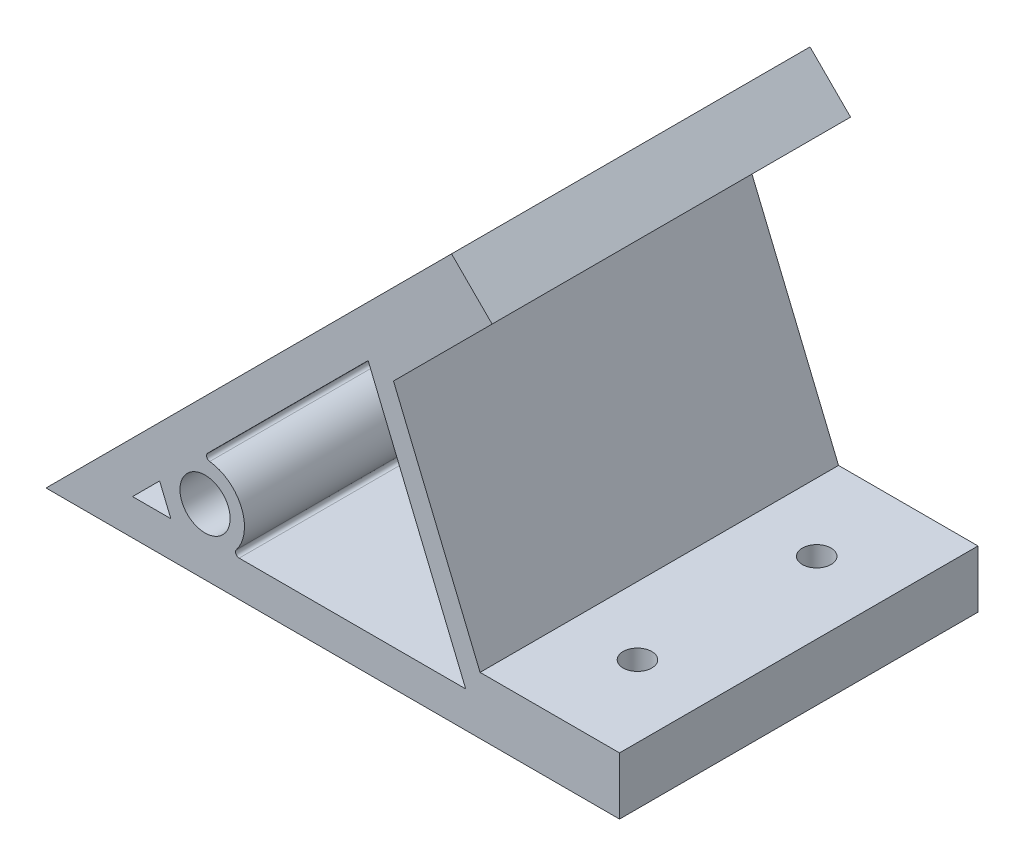
ISO-10303-21;
HEADER;
FILE_DESCRIPTION(('STEP AP214'),'2;1');
FILE_NAME('part.step','',(''),(''),'','','');
FILE_SCHEMA(('AUTOMOTIVE_DESIGN { 1 0 10303 214 1 1 1 1 }'));
ENDSEC;
DATA;
#1=APPLICATION_CONTEXT('core data for automotive mechanical design processes');
#2=APPLICATION_PROTOCOL_DEFINITION('international standard','automotive_design',2000,#1);
#3=PRODUCT_CONTEXT('',#1,'mechanical');
#4=PRODUCT('Part','Part','',(#3));
#5=PRODUCT_RELATED_PRODUCT_CATEGORY('part','',(#4));
#6=PRODUCT_DEFINITION_FORMATION('','',#4);
#7=PRODUCT_DEFINITION_CONTEXT('part definition',#1,'design');
#8=PRODUCT_DEFINITION('design','',#6,#7);
#9=PRODUCT_DEFINITION_SHAPE('','',#8);
#10=(LENGTH_UNIT() NAMED_UNIT(*) SI_UNIT(.MILLI.,.METRE.));
#11=(NAMED_UNIT(*) PLANE_ANGLE_UNIT() SI_UNIT($,.RADIAN.));
#12=(NAMED_UNIT(*) SI_UNIT($,.STERADIAN.) SOLID_ANGLE_UNIT());
#13=UNCERTAINTY_MEASURE_WITH_UNIT(LENGTH_MEASURE(1.E-05),#10,'distance_accuracy_value','');
#14=(GEOMETRIC_REPRESENTATION_CONTEXT(3) GLOBAL_UNCERTAINTY_ASSIGNED_CONTEXT((#13)) GLOBAL_UNIT_ASSIGNED_CONTEXT((#10,
#11,#12)) REPRESENTATION_CONTEXT('',''));
#15=CARTESIAN_POINT('',(0.,0.,0.));
#16=DIRECTION('',(0.,0.,1.));
#17=DIRECTION('',(1.,0.,0.));
#18=AXIS2_PLACEMENT_3D('',#15,#16,#17);
#19=CARTESIAN_POINT('',(80.,0.,25.));
#20=DIRECTION('',(0.,0.,1.));
#21=DIRECTION('',(1.,0.,0.));
#22=AXIS2_PLACEMENT_3D('',#19,#20,#21);
#23=PLANE('',#22);
#24=CARTESIAN_POINT('',(22.1846771867485,9.15647377294881,25.));
#25=DIRECTION('',(0.,0.,1.));
#26=DIRECTION('',(1.,0.,0.));
#27=AXIS2_PLACEMENT_3D('',#24,#25,#26);
#28=CIRCLE('',#27,3.5);
#29=CARTESIAN_POINT('',(25.6846771867485,9.15647377294881,25.));
#30=VERTEX_POINT('',#29);
#31=EDGE_CURVE('E211',#30,#30,#28,.T.);
#32=ORIENTED_EDGE('',*,*,#31,.F.);
#33=EDGE_LOOP('',(#32));
#34=FACE_BOUND('',#33,.T.);
#35=DIRECTION('',(1.,0.,0.));
#36=VECTOR('',#35,1.);
#37=CARTESIAN_POINT('',(0.,0.,25.));
#38=LINE('',#37,#36);
#39=CARTESIAN_POINT('',(0.,0.,25.));
#40=VERTEX_POINT('',#39);
#41=CARTESIAN_POINT('',(80.,0.,25.));
#42=VERTEX_POINT('',#41);
#43=EDGE_CURVE('E241',#40,#42,#38,.T.);
#44=ORIENTED_EDGE('',*,*,#43,.T.);
#45=DIRECTION('',(0.,1.,0.));
#46=VECTOR('',#45,1.);
#47=CARTESIAN_POINT('',(80.,0.,25.));
#48=LINE('',#47,#46);
#49=CARTESIAN_POINT('',(80.,8.,25.));
#50=VERTEX_POINT('',#49);
#51=EDGE_CURVE('E244',#42,#50,#48,.T.);
#52=ORIENTED_EDGE('',*,*,#51,.T.);
#53=DIRECTION('',(-1.,0.,0.));
#54=VECTOR('',#53,1.);
#55=CARTESIAN_POINT('',(60.5474313182664,8.,25.));
#56=LINE('',#55,#54);
#57=CARTESIAN_POINT('',(60.5474313182664,8.,25.));
#58=VERTEX_POINT('',#57);
#59=EDGE_CURVE('E247',#50,#58,#56,.T.);
#60=ORIENTED_EDGE('',*,*,#59,.T.);
#61=DIRECTION('',(-0.382683432365087,0.923879532511288,0.));
#62=VECTOR('',#61,1.);
#63=CARTESIAN_POINT('',(60.5474313182664,8.,25.));
#64=LINE('',#63,#62);
#65=CARTESIAN_POINT('',(48.4703535180654,37.1566450190806,25.));
#66=VERTEX_POINT('',#65);
#67=EDGE_CURVE('E249',#58,#66,#64,.T.);
#68=ORIENTED_EDGE('',*,*,#67,.T.);
#69=DIRECTION('',(0.707106781186547,0.707106781186548,0.));
#70=VECTOR('',#69,1.);
#71=CARTESIAN_POINT('',(48.4703535180654,37.1566450190806,25.));
#72=LINE('',#71,#70);
#73=CARTESIAN_POINT('',(62.2253967444162,50.9116882454314,25.));
#74=VERTEX_POINT('',#73);
#75=EDGE_CURVE('E251',#66,#74,#72,.T.);
#76=ORIENTED_EDGE('',*,*,#75,.T.);
#77=DIRECTION('',(-0.707106781186549,0.707106781186546,0.));
#78=VECTOR('',#77,1.);
#79=CARTESIAN_POINT('',(62.2253967444162,50.9116882454314,25.));
#80=LINE('',#79,#78);
#81=CARTESIAN_POINT('',(56.5685424949237,56.5685424949239,25.));
#82=VERTEX_POINT('',#81);
#83=EDGE_CURVE('E253',#74,#82,#80,.T.);
#84=ORIENTED_EDGE('',*,*,#83,.T.);
#85=DIRECTION('',(-0.707106781186546,-0.707106781186549,0.));
#86=VECTOR('',#85,1.);
#87=CARTESIAN_POINT('',(0.,0.,25.));
#88=LINE('',#87,#86);
#89=EDGE_CURVE('E255',#82,#40,#88,.T.);
#90=ORIENTED_EDGE('',*,*,#89,.T.);
#91=EDGE_LOOP('',(#44,#52,#60,#68,#76,#84,#90));
#92=FACE_BOUND('',#91,.T.);
#93=DIRECTION('',(-0.382683432365087,0.923879532511288,0.));
#94=VECTOR('',#93,1.);
#95=CARTESIAN_POINT('',(15.8476713770087,8.77660356514327,25.));
#96=LINE('',#95,#94);
#97=CARTESIAN_POINT('',(17.4119917933976,5.,25.));
#98=VERTEX_POINT('',#97);
#99=CARTESIAN_POINT('',(15.8476713770087,8.77660356514326,25.));
#100=VERTEX_POINT('',#99);
#101=EDGE_CURVE('E219',#98,#100,#96,.T.);
#102=ORIENTED_EDGE('',*,*,#101,.F.);
#103=DIRECTION('',(1.,0.,0.));
#104=VECTOR('',#103,1.);
#105=CARTESIAN_POINT('',(12.0710678118655,5.,25.));
#106=LINE('',#105,#104);
#107=CARTESIAN_POINT('',(12.0710678118655,5.,25.));
#108=VERTEX_POINT('',#107);
#109=EDGE_CURVE('E217',#108,#98,#106,.T.);
#110=ORIENTED_EDGE('',*,*,#109,.F.);
#111=DIRECTION('',(-0.707106781186543,-0.707106781186552,0.));
#112=VECTOR('',#111,1.);
#113=CARTESIAN_POINT('',(12.0710678118655,5.,25.));
#114=LINE('',#113,#112);
#115=EDGE_CURVE('E223',#100,#108,#114,.T.);
#116=ORIENTED_EDGE('',*,*,#115,.F.);
#117=EDGE_LOOP('',(#102,#110,#116));
#118=FACE_BOUND('',#117,.T.);
#119=DIRECTION('',(1.,0.,0.));
#120=VECTOR('',#119,1.);
#121=CARTESIAN_POINT('',(26.9417981172838,5.,25.));
#122=LINE('',#121,#120);
#123=CARTESIAN_POINT('',(26.9417981172838,5.,25.));
#124=VERTEX_POINT('',#123);
#125=CARTESIAN_POINT('',(58.5428954045085,5.,25.));
#126=VERTEX_POINT('',#125);
#127=EDGE_CURVE('E166',#124,#126,#122,.T.);
#128=ORIENTED_EDGE('',*,*,#127,.F.);
#129=CARTESIAN_POINT('',(26.9417981172838,5.5,25.));
#130=DIRECTION('',(0.,0.,1.));
#131=DIRECTION('',(-1.,0.,0.));
#132=AXIS2_PLACEMENT_3D('',#129,#130,#131);
#133=CIRCLE('',#132,0.5);
#134=CARTESIAN_POINT('',(26.5453713730726,5.80470614774571,25.));
#135=VERTEX_POINT('',#134);
#136=EDGE_CURVE('E158',#135,#124,#133,.T.);
#137=ORIENTED_EDGE('',*,*,#136,.F.);
#138=CARTESIAN_POINT('',(22.1846771867485,9.15647377294881,25.));
#139=DIRECTION('',(0.,0.,-1.));
#140=DIRECTION('',(1.,0.,0.));
#141=AXIS2_PLACEMENT_3D('',#138,#139,#140);
#142=CIRCLE('',#141,5.5);
#143=CARTESIAN_POINT('',(22.8337204048437,14.6180434100627,25.));
#144=VERTEX_POINT('',#143);
#145=EDGE_CURVE('E188',#144,#135,#142,.T.);
#146=ORIENTED_EDGE('',*,*,#145,.F.);
#147=CARTESIAN_POINT('',(22.8927243337614,15.1145497407095,25.));
#148=DIRECTION('',(0.,0.,1.));
#149=DIRECTION('',(1.,0.,0.));
#150=AXIS2_PLACEMENT_3D('',#147,#148,#149);
#151=CIRCLE('',#150,0.500000000000001);
#152=CARTESIAN_POINT('',(22.5391709431682,15.4681031313028,25.));
#153=VERTEX_POINT('',#152);
#154=EDGE_CURVE('E186',#153,#144,#151,.T.);
#155=ORIENTED_EDGE('',*,*,#154,.F.);
#156=DIRECTION('',(-0.707106781186546,-0.707106781186549,0.));
#157=VECTOR('',#156,1.);
#158=CARTESIAN_POINT('',(22.5391709431682,15.4681031313028,25.));
#159=LINE('',#158,#157);
#160=CARTESIAN_POINT('',(44.9316122367555,37.8605444248902,25.));
#161=VERTEX_POINT('',#160);
#162=EDGE_CURVE('E181',#161,#153,#159,.T.);
#163=ORIENTED_EDGE('',*,*,#162,.F.);
#164=DIRECTION('',(-0.382683432365087,0.923879532511288,0.));
#165=VECTOR('',#164,1.);
#166=CARTESIAN_POINT('',(58.5428954045085,5.,25.));
#167=LINE('',#166,#165);
#168=EDGE_CURVE('E179',#126,#161,#167,.T.);
#169=ORIENTED_EDGE('',*,*,#168,.F.);
#170=EDGE_LOOP('',(#128,#137,#146,#155,#163,#169));
#171=FACE_BOUND('',#170,.T.);
#172=ADVANCED_FACE('F43',(#34,#92,#118,#171),#23,.T.);
#173=CARTESIAN_POINT('',(80.,0.,-25.));
#174=DIRECTION('',(0.,0.,1.));
#175=DIRECTION('',(1.,0.,0.));
#176=AXIS2_PLACEMENT_3D('',#173,#174,#175);
#177=PLANE('',#176);
#178=CARTESIAN_POINT('',(22.1846771867485,9.15647377294881,-25.));
#179=DIRECTION('',(0.,0.,1.));
#180=DIRECTION('',(1.,0.,0.));
#181=AXIS2_PLACEMENT_3D('',#178,#179,#180);
#182=CIRCLE('',#181,3.5);
#183=CARTESIAN_POINT('',(25.6846771867485,9.15647377294881,-25.));
#184=VERTEX_POINT('',#183);
#185=EDGE_CURVE('E174',#184,#184,#182,.T.);
#186=ORIENTED_EDGE('',*,*,#185,.T.);
#187=EDGE_LOOP('',(#186));
#188=FACE_BOUND('',#187,.T.);
#189=DIRECTION('',(1.,0.,0.));
#190=VECTOR('',#189,1.);
#191=CARTESIAN_POINT('',(0.,0.,-25.));
#192=LINE('',#191,#190);
#193=CARTESIAN_POINT('',(0.,0.,-25.));
#194=VERTEX_POINT('',#193);
#195=CARTESIAN_POINT('',(80.,0.,-25.));
#196=VERTEX_POINT('',#195);
#197=EDGE_CURVE('E240',#194,#196,#192,.T.);
#198=ORIENTED_EDGE('',*,*,#197,.F.);
#199=DIRECTION('',(-0.707106781186546,-0.707106781186549,0.));
#200=VECTOR('',#199,1.);
#201=CARTESIAN_POINT('',(0.,0.,-25.));
#202=LINE('',#201,#200);
#203=CARTESIAN_POINT('',(56.5685424949237,56.5685424949239,-25.));
#204=VERTEX_POINT('',#203);
#205=EDGE_CURVE('E245',#204,#194,#202,.T.);
#206=ORIENTED_EDGE('',*,*,#205,.F.);
#207=DIRECTION('',(-0.707106781186549,0.707106781186546,0.));
#208=VECTOR('',#207,1.);
#209=CARTESIAN_POINT('',(62.2253967444162,50.9116882454314,-25.));
#210=LINE('',#209,#208);
#211=CARTESIAN_POINT('',(62.2253967444162,50.9116882454314,-25.));
#212=VERTEX_POINT('',#211);
#213=EDGE_CURVE('E268',#212,#204,#210,.T.);
#214=ORIENTED_EDGE('',*,*,#213,.F.);
#215=DIRECTION('',(0.707106781186547,0.707106781186548,0.));
#216=VECTOR('',#215,1.);
#217=CARTESIAN_POINT('',(48.4703535180654,37.1566450190806,-25.));
#218=LINE('',#217,#216);
#219=CARTESIAN_POINT('',(48.4703535180654,37.1566450190806,-25.));
#220=VERTEX_POINT('',#219);
#221=EDGE_CURVE('E266',#220,#212,#218,.T.);
#222=ORIENTED_EDGE('',*,*,#221,.F.);
#223=DIRECTION('',(-0.382683432365087,0.923879532511288,0.));
#224=VECTOR('',#223,1.);
#225=CARTESIAN_POINT('',(60.5474313182664,8.,-25.));
#226=LINE('',#225,#224);
#227=CARTESIAN_POINT('',(60.5474313182664,8.,-25.));
#228=VERTEX_POINT('',#227);
#229=EDGE_CURVE('E264',#228,#220,#226,.T.);
#230=ORIENTED_EDGE('',*,*,#229,.F.);
#231=DIRECTION('',(-1.,0.,0.));
#232=VECTOR('',#231,1.);
#233=CARTESIAN_POINT('',(60.5474313182664,8.,-25.));
#234=LINE('',#233,#232);
#235=CARTESIAN_POINT('',(80.,8.,-25.));
#236=VERTEX_POINT('',#235);
#237=EDGE_CURVE('E262',#236,#228,#234,.T.);
#238=ORIENTED_EDGE('',*,*,#237,.F.);
#239=DIRECTION('',(0.,1.,0.));
#240=VECTOR('',#239,1.);
#241=CARTESIAN_POINT('',(80.,0.,-25.));
#242=LINE('',#241,#240);
#243=EDGE_CURVE('E260',#196,#236,#242,.T.);
#244=ORIENTED_EDGE('',*,*,#243,.F.);
#245=EDGE_LOOP('',(#198,#206,#214,#222,#230,#238,#244));
#246=FACE_BOUND('',#245,.T.);
#247=DIRECTION('',(1.,0.,0.));
#248=VECTOR('',#247,1.);
#249=CARTESIAN_POINT('',(12.0710678118655,5.,-25.));
#250=LINE('',#249,#248);
#251=CARTESIAN_POINT('',(12.0710678118655,5.,-25.));
#252=VERTEX_POINT('',#251);
#253=CARTESIAN_POINT('',(17.4119917933976,5.,-25.));
#254=VERTEX_POINT('',#253);
#255=EDGE_CURVE('E214',#252,#254,#250,.T.);
#256=ORIENTED_EDGE('',*,*,#255,.T.);
#257=DIRECTION('',(-0.382683432365087,0.923879532511288,0.));
#258=VECTOR('',#257,1.);
#259=CARTESIAN_POINT('',(15.8476713770087,8.77660356514327,-25.));
#260=LINE('',#259,#258);
#261=CARTESIAN_POINT('',(15.8476713770087,8.77660356514327,-25.));
#262=VERTEX_POINT('',#261);
#263=EDGE_CURVE('E228',#254,#262,#260,.T.);
#264=ORIENTED_EDGE('',*,*,#263,.T.);
#265=DIRECTION('',(-0.707106781186543,-0.707106781186552,0.));
#266=VECTOR('',#265,1.);
#267=CARTESIAN_POINT('',(12.0710678118655,5.,-25.));
#268=LINE('',#267,#266);
#269=EDGE_CURVE('E220',#262,#252,#268,.T.);
#270=ORIENTED_EDGE('',*,*,#269,.T.);
#271=EDGE_LOOP('',(#256,#264,#270));
#272=FACE_BOUND('',#271,.T.);
#273=CARTESIAN_POINT('',(26.9417981172838,5.5,-25.));
#274=DIRECTION('',(0.,0.,1.));
#275=DIRECTION('',(-1.,0.,0.));
#276=AXIS2_PLACEMENT_3D('',#273,#274,#275);
#277=CIRCLE('',#276,0.5);
#278=CARTESIAN_POINT('',(26.5453713730726,5.8047061477457,-25.));
#279=VERTEX_POINT('',#278);
#280=CARTESIAN_POINT('',(26.9417981172838,5.,-25.));
#281=VERTEX_POINT('',#280);
#282=EDGE_CURVE('E68',#279,#281,#277,.T.);
#283=ORIENTED_EDGE('',*,*,#282,.T.);
#284=DIRECTION('',(1.,0.,0.));
#285=VECTOR('',#284,1.);
#286=CARTESIAN_POINT('',(26.9417981172838,5.,-25.));
#287=LINE('',#286,#285);
#288=CARTESIAN_POINT('',(58.5428954045085,5.,-25.));
#289=VERTEX_POINT('',#288);
#290=EDGE_CURVE('E173',#281,#289,#287,.T.);
#291=ORIENTED_EDGE('',*,*,#290,.T.);
#292=DIRECTION('',(-0.382683432365087,0.923879532511288,0.));
#293=VECTOR('',#292,1.);
#294=CARTESIAN_POINT('',(58.5428954045085,5.,-25.));
#295=LINE('',#294,#293);
#296=CARTESIAN_POINT('',(44.9316122367555,37.8605444248902,-25.));
#297=VERTEX_POINT('',#296);
#298=EDGE_CURVE('E193',#289,#297,#295,.T.);
#299=ORIENTED_EDGE('',*,*,#298,.T.);
#300=DIRECTION('',(-0.707106781186546,-0.707106781186549,0.));
#301=VECTOR('',#300,1.);
#302=CARTESIAN_POINT('',(22.5391709431682,15.4681031313028,-25.));
#303=LINE('',#302,#301);
#304=CARTESIAN_POINT('',(22.5391709431682,15.4681031313028,-25.));
#305=VERTEX_POINT('',#304);
#306=EDGE_CURVE('E196',#297,#305,#303,.T.);
#307=ORIENTED_EDGE('',*,*,#306,.T.);
#308=CARTESIAN_POINT('',(22.8927243337614,15.1145497407095,-25.));
#309=DIRECTION('',(0.,0.,1.));
#310=DIRECTION('',(1.,0.,0.));
#311=AXIS2_PLACEMENT_3D('',#308,#309,#310);
#312=CIRCLE('',#311,0.500000000000001);
#313=CARTESIAN_POINT('',(22.8337204048437,14.6180434100628,-25.));
#314=VERTEX_POINT('',#313);
#315=EDGE_CURVE('E199',#305,#314,#312,.T.);
#316=ORIENTED_EDGE('',*,*,#315,.T.);
#317=CARTESIAN_POINT('',(22.1846771867485,9.15647377294881,-25.));
#318=DIRECTION('',(0.,0.,-1.));
#319=DIRECTION('',(1.,0.,0.));
#320=AXIS2_PLACEMENT_3D('',#317,#318,#319);
#321=CIRCLE('',#320,5.5);
#322=EDGE_CURVE('E167',#314,#279,#321,.T.);
#323=ORIENTED_EDGE('',*,*,#322,.T.);
#324=EDGE_LOOP('',(#283,#291,#299,#307,#316,#323));
#325=FACE_BOUND('',#324,.T.);
#326=ADVANCED_FACE('F329',(#188,#246,#272,#325),#177,.F.);
#327=CARTESIAN_POINT('',(0.,0.,25.));
#328=DIRECTION('',(0.,1.,0.));
#329=DIRECTION('',(0.,0.,1.));
#330=AXIS2_PLACEMENT_3D('',#327,#328,#329);
#331=PLANE('',#330);
#332=CARTESIAN_POINT('',(70.,0.,-12.5));
#333=DIRECTION('',(0.,-1.,0.));
#334=DIRECTION('',(0.,0.,-1.));
#335=AXIS2_PLACEMENT_3D('',#332,#333,#334);
#336=CIRCLE('',#335,2.);
#337=CARTESIAN_POINT('',(70.,0.,-14.5));
#338=VERTEX_POINT('',#337);
#339=EDGE_CURVE('E300',#338,#338,#336,.T.);
#340=ORIENTED_EDGE('',*,*,#339,.F.);
#341=EDGE_LOOP('',(#340));
#342=FACE_BOUND('',#341,.T.);
#343=CARTESIAN_POINT('',(70.,0.,12.5));
#344=DIRECTION('',(0.,-1.,0.));
#345=DIRECTION('',(0.,0.,-1.));
#346=AXIS2_PLACEMENT_3D('',#343,#344,#345);
#347=CIRCLE('',#346,2.);
#348=CARTESIAN_POINT('',(70.,0.,10.5));
#349=VERTEX_POINT('',#348);
#350=EDGE_CURVE('E289',#349,#349,#347,.T.);
#351=ORIENTED_EDGE('',*,*,#350,.F.);
#352=EDGE_LOOP('',(#351));
#353=FACE_BOUND('',#352,.T.);
#354=ORIENTED_EDGE('',*,*,#197,.T.);
#355=DIRECTION('',(0.,0.,-1.));
#356=VECTOR('',#355,1.);
#357=CARTESIAN_POINT('',(80.,0.,25.));
#358=LINE('',#357,#356);
#359=EDGE_CURVE('E13',#42,#196,#358,.T.);
#360=ORIENTED_EDGE('',*,*,#359,.F.);
#361=ORIENTED_EDGE('',*,*,#43,.F.);
#362=DIRECTION('',(0.,0.,-1.));
#363=VECTOR('',#362,1.);
#364=CARTESIAN_POINT('',(0.,0.,25.));
#365=LINE('',#364,#363);
#366=EDGE_CURVE('E257',#40,#194,#365,.T.);
#367=ORIENTED_EDGE('',*,*,#366,.T.);
#368=EDGE_LOOP('',(#354,#360,#361,#367));
#369=FACE_BOUND('',#368,.T.);
#370=ADVANCED_FACE('F45',(#342,#353,#369),#331,.F.);
#371=CARTESIAN_POINT('',(80.,0.,25.));
#372=DIRECTION('',(-1.,0.,0.));
#373=DIRECTION('',(0.,0.,1.));
#374=AXIS2_PLACEMENT_3D('',#371,#372,#373);
#375=PLANE('',#374);
#376=ORIENTED_EDGE('',*,*,#243,.T.);
#377=DIRECTION('',(0.,0.,-1.));
#378=VECTOR('',#377,1.);
#379=CARTESIAN_POINT('',(80.,8.,25.));
#380=LINE('',#379,#378);
#381=EDGE_CURVE('E52',#50,#236,#380,.T.);
#382=ORIENTED_EDGE('',*,*,#381,.F.);
#383=ORIENTED_EDGE('',*,*,#51,.F.);
#384=ORIENTED_EDGE('',*,*,#359,.T.);
#385=EDGE_LOOP('',(#376,#382,#383,#384));
#386=FACE_BOUND('',#385,.T.);
#387=ADVANCED_FACE('F360',(#386),#375,.F.);
#388=CARTESIAN_POINT('',(60.5474313182664,8.,25.));
#389=DIRECTION('',(0.,-1.,0.));
#390=DIRECTION('',(0.,0.,-1.));
#391=AXIS2_PLACEMENT_3D('',#388,#389,#390);
#392=PLANE('',#391);
#393=CARTESIAN_POINT('',(70.,8.,-12.5));
#394=DIRECTION('',(0.,-1.,0.));
#395=DIRECTION('',(0.,0.,-1.));
#396=AXIS2_PLACEMENT_3D('',#393,#394,#395);
#397=CIRCLE('',#396,2.);
#398=CARTESIAN_POINT('',(70.,8.,-14.5));
#399=VERTEX_POINT('',#398);
#400=EDGE_CURVE('E47',#399,#399,#397,.T.);
#401=ORIENTED_EDGE('',*,*,#400,.T.);
#402=EDGE_LOOP('',(#401));
#403=FACE_BOUND('',#402,.T.);
#404=CARTESIAN_POINT('',(70.,8.,12.5));
#405=DIRECTION('',(0.,-1.,0.));
#406=DIRECTION('',(0.,0.,-1.));
#407=AXIS2_PLACEMENT_3D('',#404,#405,#406);
#408=CIRCLE('',#407,2.);
#409=CARTESIAN_POINT('',(70.,8.,10.5));
#410=VERTEX_POINT('',#409);
#411=EDGE_CURVE('E286',#410,#410,#408,.T.);
#412=ORIENTED_EDGE('',*,*,#411,.T.);
#413=EDGE_LOOP('',(#412));
#414=FACE_BOUND('',#413,.T.);
#415=ORIENTED_EDGE('',*,*,#237,.T.);
#416=DIRECTION('',(0.,0.,-1.));
#417=VECTOR('',#416,1.);
#418=CARTESIAN_POINT('',(60.5474313182664,8.,25.));
#419=LINE('',#418,#417);
#420=EDGE_CURVE('E282',#58,#228,#419,.T.);
#421=ORIENTED_EDGE('',*,*,#420,.F.);
#422=ORIENTED_EDGE('',*,*,#59,.F.);
#423=ORIENTED_EDGE('',*,*,#381,.T.);
#424=EDGE_LOOP('',(#415,#421,#422,#423));
#425=FACE_BOUND('',#424,.T.);
#426=ADVANCED_FACE('F357',(#403,#414,#425),#392,.F.);
#427=CARTESIAN_POINT('',(60.5474313182664,8.,25.));
#428=DIRECTION('',(-0.923879532511288,-0.382683432365087,0.));
#429=DIRECTION('',(0.382683432365087,-0.923879532511288,0.));
#430=AXIS2_PLACEMENT_3D('',#427,#428,#429);
#431=PLANE('',#430);
#432=ORIENTED_EDGE('',*,*,#229,.T.);
#433=DIRECTION('',(0.,0.,-1.));
#434=VECTOR('',#433,1.);
#435=CARTESIAN_POINT('',(48.4703535180654,37.1566450190806,25.));
#436=LINE('',#435,#434);
#437=EDGE_CURVE('E279',#66,#220,#436,.T.);
#438=ORIENTED_EDGE('',*,*,#437,.F.);
#439=ORIENTED_EDGE('',*,*,#67,.F.);
#440=ORIENTED_EDGE('',*,*,#420,.T.);
#441=EDGE_LOOP('',(#432,#438,#439,#440));
#442=FACE_BOUND('',#441,.T.);
#443=ADVANCED_FACE('F353',(#442),#431,.F.);
#444=CARTESIAN_POINT('',(48.4703535180654,37.1566450190806,25.));
#445=DIRECTION('',(-0.707106781186548,0.707106781186547,0.));
#446=DIRECTION('',(-0.707106781186547,-0.707106781186548,0.));
#447=AXIS2_PLACEMENT_3D('',#444,#445,#446);
#448=PLANE('',#447);
#449=CARTESIAN_POINT('',(55.1543289325507,43.840620433566,12.5));
#450=DIRECTION('',(-0.707106781186548,0.707106781186547,0.));
#451=DIRECTION('',(-0.707106781186547,-0.707106781186548,0.));
#452=AXIS2_PLACEMENT_3D('',#449,#450,#451);
#453=CIRCLE('',#452,2.);
#454=CARTESIAN_POINT('',(53.7401153701776,42.4264068711929,12.5));
#455=VERTEX_POINT('',#454);
#456=EDGE_CURVE('E293',#455,#455,#453,.T.);
#457=ORIENTED_EDGE('',*,*,#456,.T.);
#458=EDGE_LOOP('',(#457));
#459=FACE_BOUND('',#458,.T.);
#460=CARTESIAN_POINT('',(55.1543289325507,43.840620433566,-12.5));
#461=DIRECTION('',(-0.707106781186548,0.707106781186547,0.));
#462=DIRECTION('',(-0.707106781186547,-0.707106781186548,0.));
#463=AXIS2_PLACEMENT_3D('',#460,#461,#462);
#464=CIRCLE('',#463,2.);
#465=CARTESIAN_POINT('',(53.7401153701776,42.4264068711929,-12.5));
#466=VERTEX_POINT('',#465);
#467=EDGE_CURVE('E191',#466,#466,#464,.T.);
#468=ORIENTED_EDGE('',*,*,#467,.T.);
#469=EDGE_LOOP('',(#468));
#470=FACE_BOUND('',#469,.T.);
#471=ORIENTED_EDGE('',*,*,#221,.T.);
#472=DIRECTION('',(0.,0.,-1.));
#473=VECTOR('',#472,1.);
#474=CARTESIAN_POINT('',(62.2253967444162,50.9116882454314,25.));
#475=LINE('',#474,#473);
#476=EDGE_CURVE('E276',#74,#212,#475,.T.);
#477=ORIENTED_EDGE('',*,*,#476,.F.);
#478=ORIENTED_EDGE('',*,*,#75,.F.);
#479=ORIENTED_EDGE('',*,*,#437,.T.);
#480=EDGE_LOOP('',(#471,#477,#478,#479));
#481=FACE_BOUND('',#480,.T.);
#482=ADVANCED_FACE('F310',(#459,#470,#481),#448,.F.);
#483=CARTESIAN_POINT('',(62.2253967444162,50.9116882454314,25.));
#484=DIRECTION('',(-0.707106781186546,-0.707106781186549,0.));
#485=DIRECTION('',(0.707106781186549,-0.707106781186546,0.));
#486=AXIS2_PLACEMENT_3D('',#483,#484,#485);
#487=PLANE('',#486);
#488=ORIENTED_EDGE('',*,*,#213,.T.);
#489=DIRECTION('',(0.,0.,-1.));
#490=VECTOR('',#489,1.);
#491=CARTESIAN_POINT('',(56.5685424949237,56.5685424949239,25.));
#492=LINE('',#491,#490);
#493=EDGE_CURVE('E273',#82,#204,#492,.T.);
#494=ORIENTED_EDGE('',*,*,#493,.F.);
#495=ORIENTED_EDGE('',*,*,#83,.F.);
#496=ORIENTED_EDGE('',*,*,#476,.T.);
#497=EDGE_LOOP('',(#488,#494,#495,#496));
#498=FACE_BOUND('',#497,.T.);
#499=ADVANCED_FACE('F346',(#498),#487,.F.);
#500=CARTESIAN_POINT('',(0.,0.,25.));
#501=DIRECTION('',(0.707106781186549,-0.707106781186546,0.));
#502=DIRECTION('',(0.707106781186546,0.707106781186549,0.));
#503=AXIS2_PLACEMENT_3D('',#500,#501,#502);
#504=PLANE('',#503);
#505=CARTESIAN_POINT('',(49.4974746830583,49.4974746830584,12.5));
#506=DIRECTION('',(-0.707106781186549,0.707106781186546,0.));
#507=DIRECTION('',(-0.707106781186546,-0.707106781186549,0.));
#508=AXIS2_PLACEMENT_3D('',#505,#506,#507);
#509=CIRCLE('',#508,2.);
#510=CARTESIAN_POINT('',(48.0832611206852,48.0832611206853,12.5));
#511=VERTEX_POINT('',#510);
#512=EDGE_CURVE('E288',#511,#511,#509,.T.);
#513=ORIENTED_EDGE('',*,*,#512,.F.);
#514=EDGE_LOOP('',(#513));
#515=FACE_BOUND('',#514,.T.);
#516=CARTESIAN_POINT('',(49.4974746830583,49.4974746830584,-12.5));
#517=DIRECTION('',(-0.707106781186549,0.707106781186546,0.));
#518=DIRECTION('',(-0.707106781186546,-0.707106781186549,0.));
#519=AXIS2_PLACEMENT_3D('',#516,#517,#518);
#520=CIRCLE('',#519,2.);
#521=CARTESIAN_POINT('',(48.0832611206852,48.0832611206853,-12.5));
#522=VERTEX_POINT('',#521);
#523=EDGE_CURVE('E305',#522,#522,#520,.T.);
#524=ORIENTED_EDGE('',*,*,#523,.F.);
#525=EDGE_LOOP('',(#524));
#526=FACE_BOUND('',#525,.T.);
#527=ORIENTED_EDGE('',*,*,#205,.T.);
#528=ORIENTED_EDGE('',*,*,#366,.F.);
#529=ORIENTED_EDGE('',*,*,#89,.F.);
#530=ORIENTED_EDGE('',*,*,#493,.T.);
#531=EDGE_LOOP('',(#527,#528,#529,#530));
#532=FACE_BOUND('',#531,.T.);
#533=ADVANCED_FACE('F343',(#515,#526,#532),#504,.F.);
#534=CARTESIAN_POINT('',(12.0710678118655,5.,25.));
#535=DIRECTION('',(0.,1.,0.));
#536=DIRECTION('',(0.,0.,1.));
#537=AXIS2_PLACEMENT_3D('',#534,#535,#536);
#538=PLANE('',#537);
#539=ORIENTED_EDGE('',*,*,#255,.F.);
#540=DIRECTION('',(0.,0.,-1.));
#541=VECTOR('',#540,1.);
#542=CARTESIAN_POINT('',(12.0710678118655,5.,25.));
#543=LINE('',#542,#541);
#544=EDGE_CURVE('E225',#108,#252,#543,.T.);
#545=ORIENTED_EDGE('',*,*,#544,.F.);
#546=ORIENTED_EDGE('',*,*,#109,.T.);
#547=DIRECTION('',(0.,0.,-1.));
#548=VECTOR('',#547,1.);
#549=CARTESIAN_POINT('',(17.4119917933976,5.,25.));
#550=LINE('',#549,#548);
#551=EDGE_CURVE('E237',#98,#254,#550,.T.);
#552=ORIENTED_EDGE('',*,*,#551,.T.);
#553=EDGE_LOOP('',(#539,#545,#546,#552));
#554=FACE_BOUND('',#553,.T.);
#555=ADVANCED_FACE('F340',(#554),#538,.T.);
#556=CARTESIAN_POINT('',(15.8476713770087,8.77660356514327,25.));
#557=DIRECTION('',(-0.923879532511288,-0.382683432365087,0.));
#558=DIRECTION('',(0.382683432365087,-0.923879532511288,0.));
#559=AXIS2_PLACEMENT_3D('',#556,#557,#558);
#560=PLANE('',#559);
#561=ORIENTED_EDGE('',*,*,#263,.F.);
#562=ORIENTED_EDGE('',*,*,#551,.F.);
#563=ORIENTED_EDGE('',*,*,#101,.T.);
#564=DIRECTION('',(0.,0.,-1.));
#565=VECTOR('',#564,1.);
#566=CARTESIAN_POINT('',(15.8476713770087,8.77660356514327,25.));
#567=LINE('',#566,#565);
#568=EDGE_CURVE('E235',#100,#262,#567,.T.);
#569=ORIENTED_EDGE('',*,*,#568,.T.);
#570=EDGE_LOOP('',(#561,#562,#563,#569));
#571=FACE_BOUND('',#570,.T.);
#572=ADVANCED_FACE('F398',(#571),#560,.T.);
#573=CARTESIAN_POINT('',(12.0710678118655,5.,25.));
#574=DIRECTION('',(0.707106781186552,-0.707106781186543,0.));
#575=DIRECTION('',(0.707106781186543,0.707106781186552,0.));
#576=AXIS2_PLACEMENT_3D('',#573,#574,#575);
#577=PLANE('',#576);
#578=ORIENTED_EDGE('',*,*,#269,.F.);
#579=ORIENTED_EDGE('',*,*,#568,.F.);
#580=ORIENTED_EDGE('',*,*,#115,.T.);
#581=ORIENTED_EDGE('',*,*,#544,.T.);
#582=EDGE_LOOP('',(#578,#579,#580,#581));
#583=FACE_BOUND('',#582,.T.);
#584=ADVANCED_FACE('F404',(#583),#577,.T.);
#585=CARTESIAN_POINT('',(22.1846771867485,9.15647377294881,25.));
#586=DIRECTION('',(0.,0.,-1.));
#587=DIRECTION('',(-1.,0.,0.));
#588=AXIS2_PLACEMENT_3D('',#585,#586,#587);
#589=CYLINDRICAL_SURFACE('',#588,3.5);
#590=ORIENTED_EDGE('',*,*,#31,.T.);
#591=EDGE_LOOP('',(#590));
#592=FACE_BOUND('',#591,.T.);
#593=ORIENTED_EDGE('',*,*,#185,.F.);
#594=EDGE_LOOP('',(#593));
#595=FACE_BOUND('',#594,.T.);
#596=ADVANCED_FACE('F406',(#592,#595),#589,.F.);
#597=CARTESIAN_POINT('',(26.9417981172838,5.5,25.));
#598=DIRECTION('',(0.,0.,-1.));
#599=DIRECTION('',(-1.,0.,0.));
#600=AXIS2_PLACEMENT_3D('',#597,#598,#599);
#601=CYLINDRICAL_SURFACE('',#600,0.5);
#602=ORIENTED_EDGE('',*,*,#282,.F.);
#603=DIRECTION('',(0.,0.,-1.));
#604=VECTOR('',#603,1.);
#605=CARTESIAN_POINT('',(26.5453713730726,5.80470614774571,25.));
#606=LINE('',#605,#604);
#607=EDGE_CURVE('E162',#135,#279,#606,.T.);
#608=ORIENTED_EDGE('',*,*,#607,.F.);
#609=ORIENTED_EDGE('',*,*,#136,.T.);
#610=DIRECTION('',(0.,0.,-1.));
#611=VECTOR('',#610,1.);
#612=CARTESIAN_POINT('',(26.9417981172838,5.,25.));
#613=LINE('',#612,#611);
#614=EDGE_CURVE('E161',#124,#281,#613,.T.);
#615=ORIENTED_EDGE('',*,*,#614,.T.);
#616=EDGE_LOOP('',(#602,#608,#609,#615));
#617=FACE_BOUND('',#616,.T.);
#618=ADVANCED_FACE('F160',(#617),#601,.F.);
#619=CARTESIAN_POINT('',(26.9417981172838,5.,25.));
#620=DIRECTION('',(0.,1.,0.));
#621=DIRECTION('',(-1.,0.,0.));
#622=AXIS2_PLACEMENT_3D('',#619,#620,#621);
#623=PLANE('',#622);
#624=ORIENTED_EDGE('',*,*,#290,.F.);
#625=ORIENTED_EDGE('',*,*,#614,.F.);
#626=ORIENTED_EDGE('',*,*,#127,.T.);
#627=DIRECTION('',(0.,0.,-1.));
#628=VECTOR('',#627,1.);
#629=CARTESIAN_POINT('',(58.5428954045085,5.,25.));
#630=LINE('',#629,#628);
#631=EDGE_CURVE('E175',#126,#289,#630,.T.);
#632=ORIENTED_EDGE('',*,*,#631,.T.);
#633=EDGE_LOOP('',(#624,#625,#626,#632));
#634=FACE_BOUND('',#633,.T.);
#635=ADVANCED_FACE('F170',(#634),#623,.T.);
#636=CARTESIAN_POINT('',(58.5428954045085,5.,25.));
#637=DIRECTION('',(-0.923879532511288,-0.382683432365087,0.));
#638=DIRECTION('',(0.382683432365087,-0.923879532511288,0.));
#639=AXIS2_PLACEMENT_3D('',#636,#637,#638);
#640=PLANE('',#639);
#641=ORIENTED_EDGE('',*,*,#298,.F.);
#642=ORIENTED_EDGE('',*,*,#631,.F.);
#643=ORIENTED_EDGE('',*,*,#168,.T.);
#644=DIRECTION('',(0.,0.,-1.));
#645=VECTOR('',#644,1.);
#646=CARTESIAN_POINT('',(44.9316122367555,37.8605444248902,25.));
#647=LINE('',#646,#645);
#648=EDGE_CURVE('E208',#161,#297,#647,.T.);
#649=ORIENTED_EDGE('',*,*,#648,.T.);
#650=EDGE_LOOP('',(#641,#642,#643,#649));
#651=FACE_BOUND('',#650,.T.);
#652=ADVANCED_FACE('F419',(#651),#640,.T.);
#653=CARTESIAN_POINT('',(22.5391709431682,15.4681031313028,25.));
#654=DIRECTION('',(0.707106781186549,-0.707106781186546,0.));
#655=DIRECTION('',(0.707106781186546,0.707106781186549,0.));
#656=AXIS2_PLACEMENT_3D('',#653,#654,#655);
#657=PLANE('',#656);
#658=ORIENTED_EDGE('',*,*,#306,.F.);
#659=ORIENTED_EDGE('',*,*,#648,.F.);
#660=ORIENTED_EDGE('',*,*,#162,.T.);
#661=DIRECTION('',(0.,0.,-1.));
#662=VECTOR('',#661,1.);
#663=CARTESIAN_POINT('',(22.5391709431682,15.4681031313028,25.));
#664=LINE('',#663,#662);
#665=EDGE_CURVE('E206',#153,#305,#664,.T.);
#666=ORIENTED_EDGE('',*,*,#665,.T.);
#667=EDGE_LOOP('',(#658,#659,#660,#666));
#668=FACE_BOUND('',#667,.T.);
#669=ADVANCED_FACE('F422',(#668),#657,.T.);
#670=CARTESIAN_POINT('',(22.8927243337614,15.1145497407095,25.));
#671=DIRECTION('',(0.,0.,-1.));
#672=DIRECTION('',(-1.,0.,0.));
#673=AXIS2_PLACEMENT_3D('',#670,#671,#672);
#674=CYLINDRICAL_SURFACE('',#673,0.500000000000001);
#675=ORIENTED_EDGE('',*,*,#315,.F.);
#676=ORIENTED_EDGE('',*,*,#665,.F.);
#677=ORIENTED_EDGE('',*,*,#154,.T.);
#678=DIRECTION('',(0.,0.,-1.));
#679=VECTOR('',#678,1.);
#680=CARTESIAN_POINT('',(22.8337204048437,14.6180434100628,25.));
#681=LINE('',#680,#679);
#682=EDGE_CURVE('E60',#144,#314,#681,.T.);
#683=ORIENTED_EDGE('',*,*,#682,.T.);
#684=EDGE_LOOP('',(#675,#676,#677,#683));
#685=FACE_BOUND('',#684,.T.);
#686=ADVANCED_FACE('F326',(#685),#674,.F.);
#687=CARTESIAN_POINT('',(22.1846771867485,9.15647377294881,25.));
#688=DIRECTION('',(0.,0.,-1.));
#689=DIRECTION('',(-1.,0.,0.));
#690=AXIS2_PLACEMENT_3D('',#687,#688,#689);
#691=CYLINDRICAL_SURFACE('',#690,5.5);
#692=ORIENTED_EDGE('',*,*,#322,.F.);
#693=ORIENTED_EDGE('',*,*,#682,.F.);
#694=ORIENTED_EDGE('',*,*,#145,.T.);
#695=ORIENTED_EDGE('',*,*,#607,.T.);
#696=EDGE_LOOP('',(#692,#693,#694,#695));
#697=FACE_BOUND('',#696,.T.);
#698=ADVANCED_FACE('F316',(#697),#691,.T.);
#699=CARTESIAN_POINT('',(63.6396103067892,35.3553390593275,-12.5));
#700=DIRECTION('',(-0.707106781186549,0.707106781186546,0.));
#701=DIRECTION('',(-0.707106781186546,-0.707106781186549,0.));
#702=AXIS2_PLACEMENT_3D('',#699,#700,#701);
#703=CYLINDRICAL_SURFACE('',#702,2.);
#704=ORIENTED_EDGE('',*,*,#523,.T.);
#705=EDGE_LOOP('',(#704));
#706=FACE_BOUND('',#705,.T.);
#707=ORIENTED_EDGE('',*,*,#467,.F.);
#708=EDGE_LOOP('',(#707));
#709=FACE_BOUND('',#708,.T.);
#710=ADVANCED_FACE('F313',(#706,#709),#703,.F.);
#711=CARTESIAN_POINT('',(63.6396103067892,35.3553390593275,12.5));
#712=DIRECTION('',(-0.707106781186549,0.707106781186546,0.));
#713=DIRECTION('',(-0.707106781186546,-0.707106781186549,0.));
#714=AXIS2_PLACEMENT_3D('',#711,#712,#713);
#715=CYLINDRICAL_SURFACE('',#714,2.);
#716=ORIENTED_EDGE('',*,*,#512,.T.);
#717=EDGE_LOOP('',(#716));
#718=FACE_BOUND('',#717,.T.);
#719=ORIENTED_EDGE('',*,*,#456,.F.);
#720=EDGE_LOOP('',(#719));
#721=FACE_BOUND('',#720,.T.);
#722=ADVANCED_FACE('F315',(#718,#721),#715,.F.);
#723=CARTESIAN_POINT('',(70.,20.,12.5));
#724=DIRECTION('',(0.,-1.,0.));
#725=DIRECTION('',(0.,0.,-1.));
#726=AXIS2_PLACEMENT_3D('',#723,#724,#725);
#727=CYLINDRICAL_SURFACE('',#726,2.);
#728=ORIENTED_EDGE('',*,*,#350,.T.);
#729=EDGE_LOOP('',(#728));
#730=FACE_BOUND('',#729,.T.);
#731=ORIENTED_EDGE('',*,*,#411,.F.);
#732=EDGE_LOOP('',(#731));
#733=FACE_BOUND('',#732,.T.);
#734=ADVANCED_FACE('F323',(#730,#733),#727,.F.);
#735=CARTESIAN_POINT('',(70.,20.,-12.5));
#736=DIRECTION('',(0.,-1.,0.));
#737=DIRECTION('',(0.,0.,-1.));
#738=AXIS2_PLACEMENT_3D('',#735,#736,#737);
#739=CYLINDRICAL_SURFACE('',#738,2.);
#740=ORIENTED_EDGE('',*,*,#339,.T.);
#741=EDGE_LOOP('',(#740));
#742=FACE_BOUND('',#741,.T.);
#743=ORIENTED_EDGE('',*,*,#400,.F.);
#744=EDGE_LOOP('',(#743));
#745=FACE_BOUND('',#744,.T.);
#746=ADVANCED_FACE('F492',(#742,#745),#739,.F.);
#747=CLOSED_SHELL('',(#172,#326,#370,#387,#426,#443,#482,#499,#533,#555,#572,#584,#596,#618,
#635,#652,#669,#686,#698,#710,#722,#734,#746));
#748=MANIFOLD_SOLID_BREP('B2',#747);
#749=ADVANCED_BREP_SHAPE_REPRESENTATION('',(#18,#748),#14);
#750=SHAPE_DEFINITION_REPRESENTATION(#9,#749);
ENDSEC;
END-ISO-10303-21;
